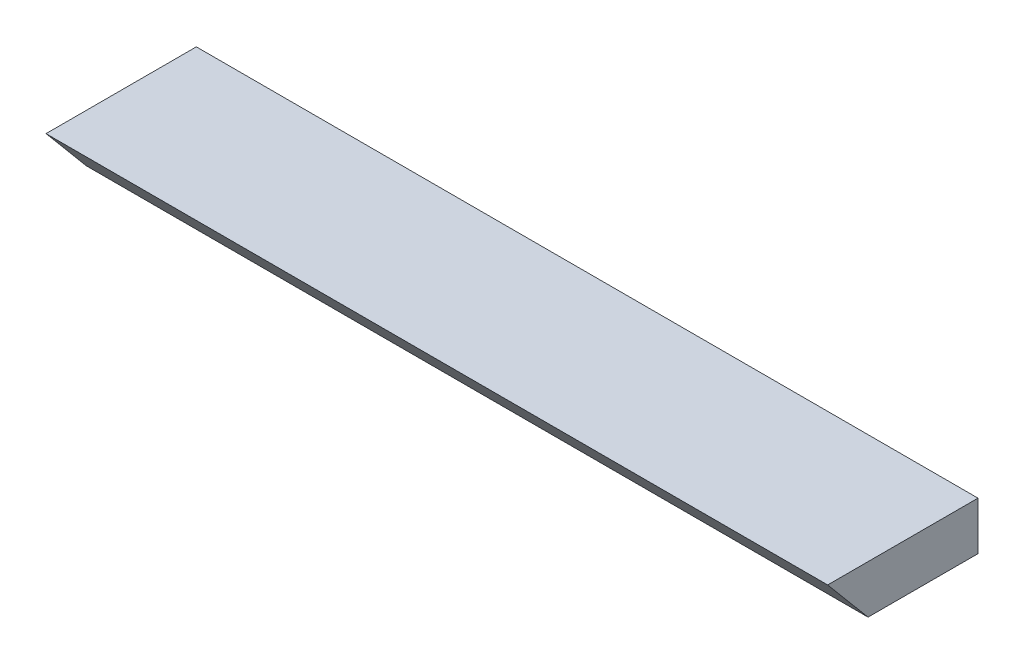
ISO-10303-21;
HEADER;
FILE_DESCRIPTION(('STEP AP214'),'2;1');
FILE_NAME('part.step','',(''),(''),'','','');
FILE_SCHEMA(('AUTOMOTIVE_DESIGN { 1 0 10303 214 1 1 1 1 }'));
ENDSEC;
DATA;
#1=APPLICATION_CONTEXT('core data for automotive mechanical design processes');
#2=APPLICATION_PROTOCOL_DEFINITION('international standard','automotive_design',2000,#1);
#3=PRODUCT_CONTEXT('',#1,'mechanical');
#4=PRODUCT('Part','Part','',(#3));
#5=PRODUCT_RELATED_PRODUCT_CATEGORY('part','',(#4));
#6=PRODUCT_DEFINITION_FORMATION('','',#4);
#7=PRODUCT_DEFINITION_CONTEXT('part definition',#1,'design');
#8=PRODUCT_DEFINITION('design','',#6,#7);
#9=PRODUCT_DEFINITION_SHAPE('','',#8);
#10=(LENGTH_UNIT() NAMED_UNIT(*) SI_UNIT(.MILLI.,.METRE.));
#11=(NAMED_UNIT(*) PLANE_ANGLE_UNIT() SI_UNIT($,.RADIAN.));
#12=(NAMED_UNIT(*) SI_UNIT($,.STERADIAN.) SOLID_ANGLE_UNIT());
#13=UNCERTAINTY_MEASURE_WITH_UNIT(LENGTH_MEASURE(1.E-05),#10,'distance_accuracy_value','');
#14=(GEOMETRIC_REPRESENTATION_CONTEXT(3) GLOBAL_UNCERTAINTY_ASSIGNED_CONTEXT((#13)) GLOBAL_UNIT_ASSIGNED_CONTEXT((#10,
#11,#12)) REPRESENTATION_CONTEXT('',''));
#15=CARTESIAN_POINT('',(0.,0.,0.));
#16=DIRECTION('',(0.,0.,1.));
#17=DIRECTION('',(1.,0.,0.));
#18=AXIS2_PLACEMENT_3D('',#15,#16,#17);
#19=CARTESIAN_POINT('',(130.,0.245873462735212,40.0835012594458));
#20=DIRECTION('',(0.,1.,0.));
#21=DIRECTION('',(0.,0.,1.));
#22=AXIS2_PLACEMENT_3D('',#19,#20,#21);
#23=PLANE('',#22);
#24=DIRECTION('',(0.,0.,-1.));
#25=VECTOR('',#24,1.);
#26=CARTESIAN_POINT('',(0.,0.245873462735212,40.0835012594458));
#27=LINE('',#26,#25);
#28=CARTESIAN_POINT('',(0.,0.245873462735198,58.3707042100276));
#29=VERTEX_POINT('',#28);
#30=CARTESIAN_POINT('',(0.,0.245873462735212,40.0835012594458));
#31=VERTEX_POINT('',#30);
#32=EDGE_CURVE('E99',#29,#31,#27,.T.);
#33=ORIENTED_EDGE('',*,*,#32,.T.);
#34=DIRECTION('',(-1.,0.,0.));
#35=VECTOR('',#34,1.);
#36=CARTESIAN_POINT('',(130.,0.245873462735212,40.0835012594458));
#37=LINE('',#36,#35);
#38=CARTESIAN_POINT('',(130.,0.245873462735212,40.0835012594458));
#39=VERTEX_POINT('',#38);
#40=EDGE_CURVE('E11',#39,#31,#37,.T.);
#41=ORIENTED_EDGE('',*,*,#40,.F.);
#42=DIRECTION('',(0.,0.,-1.));
#43=VECTOR('',#42,1.);
#44=CARTESIAN_POINT('',(130.,0.245873462735212,40.0835012594458));
#45=LINE('',#44,#43);
#46=CARTESIAN_POINT('',(130.,0.245873462735198,58.3707042100276));
#47=VERTEX_POINT('',#46);
#48=EDGE_CURVE('E87',#47,#39,#45,.T.);
#49=ORIENTED_EDGE('',*,*,#48,.F.);
#50=DIRECTION('',(-1.,0.,0.));
#51=VECTOR('',#50,1.);
#52=CARTESIAN_POINT('',(130.,0.245873462735198,58.3707042100276));
#53=LINE('',#52,#51);
#54=EDGE_CURVE('E95',#47,#29,#53,.T.);
#55=ORIENTED_EDGE('',*,*,#54,.T.);
#56=EDGE_LOOP('',(#33,#41,#49,#55));
#57=FACE_BOUND('',#56,.T.);
#58=ADVANCED_FACE('F36',(#57),#23,.F.);
#59=CARTESIAN_POINT('',(130.,8.24587346273521,40.0835012594458));
#60=DIRECTION('',(0.,0.,1.));
#61=DIRECTION('',(0.,-1.,0.));
#62=AXIS2_PLACEMENT_3D('',#59,#60,#61);
#63=PLANE('',#62);
#64=DIRECTION('',(0.,1.,0.));
#65=VECTOR('',#64,1.);
#66=CARTESIAN_POINT('',(0.,8.24587346273521,40.0835012594458));
#67=LINE('',#66,#65);
#68=CARTESIAN_POINT('',(0.,8.24587346273521,40.0835012594458));
#69=VERTEX_POINT('',#68);
#70=EDGE_CURVE('E91',#31,#69,#67,.T.);
#71=ORIENTED_EDGE('',*,*,#70,.T.);
#72=DIRECTION('',(-1.,0.,0.));
#73=VECTOR('',#72,1.);
#74=CARTESIAN_POINT('',(130.,8.24587346273521,40.0835012594458));
#75=LINE('',#74,#73);
#76=CARTESIAN_POINT('',(130.,8.24587346273521,40.0835012594458));
#77=VERTEX_POINT('',#76);
#78=EDGE_CURVE('E44',#77,#69,#75,.T.);
#79=ORIENTED_EDGE('',*,*,#78,.F.);
#80=DIRECTION('',(0.,1.,0.));
#81=VECTOR('',#80,1.);
#82=CARTESIAN_POINT('',(130.,8.24587346273521,40.0835012594458));
#83=LINE('',#82,#81);
#84=EDGE_CURVE('E82',#39,#77,#83,.T.);
#85=ORIENTED_EDGE('',*,*,#84,.F.);
#86=ORIENTED_EDGE('',*,*,#40,.T.);
#87=EDGE_LOOP('',(#71,#79,#85,#86));
#88=FACE_BOUND('',#87,.T.);
#89=ADVANCED_FACE('F90',(#88),#63,.F.);
#90=CARTESIAN_POINT('',(130.,8.24587346273521,65.0835012594458));
#91=DIRECTION('',(0.,-1.,0.));
#92=DIRECTION('',(0.,0.,-1.));
#93=AXIS2_PLACEMENT_3D('',#90,#91,#92);
#94=PLANE('',#93);
#95=DIRECTION('',(0.,0.,1.));
#96=VECTOR('',#95,1.);
#97=CARTESIAN_POINT('',(0.,8.24587346273521,65.0835012594458));
#98=LINE('',#97,#96);
#99=CARTESIAN_POINT('',(0.,8.24587346273521,65.0835012594458));
#100=VERTEX_POINT('',#99);
#101=EDGE_CURVE('E69',#69,#100,#98,.T.);
#102=ORIENTED_EDGE('',*,*,#101,.T.);
#103=DIRECTION('',(-1.,0.,0.));
#104=VECTOR('',#103,1.);
#105=CARTESIAN_POINT('',(130.,8.24587346273521,65.0835012594458));
#106=LINE('',#105,#104);
#107=CARTESIAN_POINT('',(130.,8.24587346273521,65.0835012594458));
#108=VERTEX_POINT('',#107);
#109=EDGE_CURVE('E92',#108,#100,#106,.T.);
#110=ORIENTED_EDGE('',*,*,#109,.F.);
#111=DIRECTION('',(0.,0.,1.));
#112=VECTOR('',#111,1.);
#113=CARTESIAN_POINT('',(130.,8.24587346273521,65.0835012594458));
#114=LINE('',#113,#112);
#115=EDGE_CURVE('E85',#77,#108,#114,.T.);
#116=ORIENTED_EDGE('',*,*,#115,.F.);
#117=ORIENTED_EDGE('',*,*,#78,.T.);
#118=EDGE_LOOP('',(#102,#110,#116,#117));
#119=FACE_BOUND('',#118,.T.);
#120=ADVANCED_FACE('F93',(#119),#94,.F.);
#121=CARTESIAN_POINT('',(130.,0.245873462735198,58.3707042100276));
#122=DIRECTION('',(0.,0.642787609686539,-0.766044443118979));
#123=DIRECTION('',(0.,0.766044443118979,0.642787609686539));
#124=AXIS2_PLACEMENT_3D('',#121,#122,#123);
#125=PLANE('',#124);
#126=DIRECTION('',(0.,-0.766044443118979,-0.642787609686539));
#127=VECTOR('',#126,1.);
#128=CARTESIAN_POINT('',(0.,0.245873462735198,58.3707042100276));
#129=LINE('',#128,#127);
#130=EDGE_CURVE('E75',#100,#29,#129,.T.);
#131=ORIENTED_EDGE('',*,*,#130,.T.);
#132=ORIENTED_EDGE('',*,*,#54,.F.);
#133=DIRECTION('',(0.,-0.766044443118979,-0.642787609686539));
#134=VECTOR('',#133,1.);
#135=CARTESIAN_POINT('',(130.,0.245873462735198,58.3707042100276));
#136=LINE('',#135,#134);
#137=EDGE_CURVE('E52',#108,#47,#136,.T.);
#138=ORIENTED_EDGE('',*,*,#137,.F.);
#139=ORIENTED_EDGE('',*,*,#109,.T.);
#140=EDGE_LOOP('',(#131,#132,#138,#139));
#141=FACE_BOUND('',#140,.T.);
#142=ADVANCED_FACE('F106',(#141),#125,.F.);
#143=CARTESIAN_POINT('',(130.,0.,0.));
#144=DIRECTION('',(1.,0.,0.));
#145=DIRECTION('',(0.,0.,-1.));
#146=AXIS2_PLACEMENT_3D('',#143,#144,#145);
#147=PLANE('',#146);
#148=ORIENTED_EDGE('',*,*,#48,.T.);
#149=ORIENTED_EDGE('',*,*,#84,.T.);
#150=ORIENTED_EDGE('',*,*,#115,.T.);
#151=ORIENTED_EDGE('',*,*,#137,.T.);
#152=EDGE_LOOP('',(#148,#149,#150,#151));
#153=FACE_BOUND('',#152,.T.);
#154=ADVANCED_FACE('F83',(#153),#147,.T.);
#155=CARTESIAN_POINT('',(0.,0.,0.));
#156=DIRECTION('',(1.,0.,0.));
#157=DIRECTION('',(0.,0.,-1.));
#158=AXIS2_PLACEMENT_3D('',#155,#156,#157);
#159=PLANE('',#158);
#160=ORIENTED_EDGE('',*,*,#32,.F.);
#161=ORIENTED_EDGE('',*,*,#130,.F.);
#162=ORIENTED_EDGE('',*,*,#101,.F.);
#163=ORIENTED_EDGE('',*,*,#70,.F.);
#164=EDGE_LOOP('',(#160,#161,#162,#163));
#165=FACE_BOUND('',#164,.T.);
#166=ADVANCED_FACE('F109',(#165),#159,.F.);
#167=CLOSED_SHELL('',(#58,#89,#120,#142,#154,#166));
#168=MANIFOLD_SOLID_BREP('B2',#167);
#169=ADVANCED_BREP_SHAPE_REPRESENTATION('',(#18,#168),#14);
#170=SHAPE_DEFINITION_REPRESENTATION(#9,#169);
ENDSEC;
END-ISO-10303-21;
